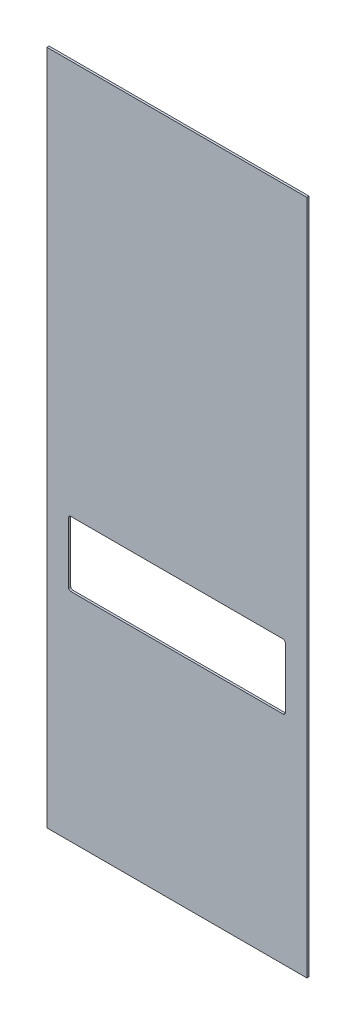
ISO-10303-21;
HEADER;
FILE_DESCRIPTION(('STEP AP214'),'2;1');
FILE_NAME('part.step','',(''),(''),'','','');
FILE_SCHEMA(('AUTOMOTIVE_DESIGN { 1 0 10303 214 1 1 1 1 }'));
ENDSEC;
DATA;
#1=APPLICATION_CONTEXT('core data for automotive mechanical design processes');
#2=APPLICATION_PROTOCOL_DEFINITION('international standard','automotive_design',2000,#1);
#3=PRODUCT_CONTEXT('',#1,'mechanical');
#4=PRODUCT('Part','Part','',(#3));
#5=PRODUCT_RELATED_PRODUCT_CATEGORY('part','',(#4));
#6=PRODUCT_DEFINITION_FORMATION('','',#4);
#7=PRODUCT_DEFINITION_CONTEXT('part definition',#1,'design');
#8=PRODUCT_DEFINITION('design','',#6,#7);
#9=PRODUCT_DEFINITION_SHAPE('','',#8);
#10=(LENGTH_UNIT() NAMED_UNIT(*) SI_UNIT(.MILLI.,.METRE.));
#11=(NAMED_UNIT(*) PLANE_ANGLE_UNIT() SI_UNIT($,.RADIAN.));
#12=(NAMED_UNIT(*) SI_UNIT($,.STERADIAN.) SOLID_ANGLE_UNIT());
#13=UNCERTAINTY_MEASURE_WITH_UNIT(LENGTH_MEASURE(1.E-05),#10,'distance_accuracy_value','');
#14=(GEOMETRIC_REPRESENTATION_CONTEXT(3) GLOBAL_UNCERTAINTY_ASSIGNED_CONTEXT((#13)) GLOBAL_UNIT_ASSIGNED_CONTEXT((#10,
#11,#12)) REPRESENTATION_CONTEXT('',''));
#15=CARTESIAN_POINT('',(0.,0.,0.));
#16=DIRECTION('',(0.,0.,1.));
#17=DIRECTION('',(1.,0.,0.));
#18=AXIS2_PLACEMENT_3D('',#15,#16,#17);
#19=CARTESIAN_POINT('',(0.,0.,6.35));
#20=DIRECTION('',(0.,0.,1.));
#21=DIRECTION('',(1.,0.,0.));
#22=AXIS2_PLACEMENT_3D('',#19,#20,#21);
#23=PLANE('',#22);
#24=CARTESIAN_POINT('',(311.15,-171.45,6.35));
#25=DIRECTION('',(0.,0.,-1.));
#26=DIRECTION('',(-1.,0.,0.));
#27=AXIS2_PLACEMENT_3D('',#24,#25,#26);
#28=CIRCLE('',#27,6.35);
#29=CARTESIAN_POINT('',(311.15,-165.1,6.35));
#30=VERTEX_POINT('',#29);
#31=CARTESIAN_POINT('',(317.5,-171.45,6.35));
#32=VERTEX_POINT('',#31);
#33=EDGE_CURVE('E19',#30,#32,#28,.T.);
#34=ORIENTED_EDGE('',*,*,#33,.T.);
#35=DIRECTION('',(0.,1.,0.));
#36=VECTOR('',#35,1.);
#37=CARTESIAN_POINT('',(317.5,-355.6,6.35));
#38=LINE('',#37,#36);
#39=CARTESIAN_POINT('',(317.5,-349.25,6.35));
#40=VERTEX_POINT('',#39);
#41=EDGE_CURVE('E143',#32,#40,#38,.F.);
#42=ORIENTED_EDGE('',*,*,#41,.T.);
#43=CARTESIAN_POINT('',(311.15,-349.25,6.35));
#44=DIRECTION('',(0.,0.,-1.));
#45=DIRECTION('',(-1.,0.,0.));
#46=AXIS2_PLACEMENT_3D('',#43,#44,#45);
#47=CIRCLE('',#46,6.35);
#48=CARTESIAN_POINT('',(311.15,-355.6,6.35));
#49=VERTEX_POINT('',#48);
#50=EDGE_CURVE('E163',#40,#49,#47,.T.);
#51=ORIENTED_EDGE('',*,*,#50,.T.);
#52=DIRECTION('',(1.,0.,0.));
#53=VECTOR('',#52,1.);
#54=CARTESIAN_POINT('',(-317.5,-355.6,6.35));
#55=LINE('',#54,#53);
#56=CARTESIAN_POINT('',(-311.15,-355.6,6.35));
#57=VERTEX_POINT('',#56);
#58=EDGE_CURVE('E139',#49,#57,#55,.F.);
#59=ORIENTED_EDGE('',*,*,#58,.T.);
#60=CARTESIAN_POINT('',(-311.15,-349.25,6.35));
#61=DIRECTION('',(0.,0.,-1.));
#62=DIRECTION('',(-1.,0.,0.));
#63=AXIS2_PLACEMENT_3D('',#60,#61,#62);
#64=CIRCLE('',#63,6.35);
#65=CARTESIAN_POINT('',(-317.5,-349.25,6.35));
#66=VERTEX_POINT('',#65);
#67=EDGE_CURVE('E162',#57,#66,#64,.T.);
#68=ORIENTED_EDGE('',*,*,#67,.T.);
#69=DIRECTION('',(0.,1.,0.));
#70=VECTOR('',#69,1.);
#71=CARTESIAN_POINT('',(-317.5,-165.1,6.35));
#72=LINE('',#71,#70);
#73=CARTESIAN_POINT('',(-317.5,-171.45,6.35));
#74=VERTEX_POINT('',#73);
#75=EDGE_CURVE('E136',#66,#74,#72,.T.);
#76=ORIENTED_EDGE('',*,*,#75,.T.);
#77=CARTESIAN_POINT('',(-311.15,-171.45,6.35));
#78=DIRECTION('',(0.,0.,-1.));
#79=DIRECTION('',(-1.,0.,0.));
#80=AXIS2_PLACEMENT_3D('',#77,#78,#79);
#81=CIRCLE('',#80,6.35);
#82=CARTESIAN_POINT('',(-311.15,-165.1,6.35));
#83=VERTEX_POINT('',#82);
#84=EDGE_CURVE('E159',#74,#83,#81,.T.);
#85=ORIENTED_EDGE('',*,*,#84,.T.);
#86=DIRECTION('',(1.,0.,0.));
#87=VECTOR('',#86,1.);
#88=CARTESIAN_POINT('',(317.5,-165.1,6.35));
#89=LINE('',#88,#87);
#90=EDGE_CURVE('E84',#83,#30,#89,.T.);
#91=ORIENTED_EDGE('',*,*,#90,.T.);
#92=EDGE_LOOP('',(#34,#42,#51,#59,#68,#76,#85,#91));
#93=FACE_BOUND('',#92,.T.);
#94=DIRECTION('',(0.,1.,0.));
#95=VECTOR('',#94,1.);
#96=CARTESIAN_POINT('',(381.,-990.6,6.35));
#97=LINE('',#96,#95);
#98=CARTESIAN_POINT('',(381.,990.6,6.35));
#99=VERTEX_POINT('',#98);
#100=CARTESIAN_POINT('',(381.,-990.6,6.35));
#101=VERTEX_POINT('',#100);
#102=EDGE_CURVE('E93',#99,#101,#97,.F.);
#103=ORIENTED_EDGE('',*,*,#102,.F.);
#104=DIRECTION('',(1.,0.,0.));
#105=VECTOR('',#104,1.);
#106=CARTESIAN_POINT('',(381.,990.6,6.35));
#107=LINE('',#106,#105);
#108=CARTESIAN_POINT('',(-381.,990.6,6.35));
#109=VERTEX_POINT('',#108);
#110=EDGE_CURVE('E120',#109,#99,#107,.T.);
#111=ORIENTED_EDGE('',*,*,#110,.F.);
#112=DIRECTION('',(0.,1.,0.));
#113=VECTOR('',#112,1.);
#114=CARTESIAN_POINT('',(-381.,990.6,6.35));
#115=LINE('',#114,#113);
#116=CARTESIAN_POINT('',(-381.,-990.6,6.35));
#117=VERTEX_POINT('',#116);
#118=EDGE_CURVE('E111',#117,#109,#115,.T.);
#119=ORIENTED_EDGE('',*,*,#118,.F.);
#120=DIRECTION('',(1.,0.,0.));
#121=VECTOR('',#120,1.);
#122=CARTESIAN_POINT('',(-381.,-990.6,6.35));
#123=LINE('',#122,#121);
#124=EDGE_CURVE('E105',#101,#117,#123,.F.);
#125=ORIENTED_EDGE('',*,*,#124,.F.);
#126=EDGE_LOOP('',(#103,#111,#119,#125));
#127=FACE_BOUND('',#126,.T.);
#128=ADVANCED_FACE('F16',(#93,#127),#23,.T.);
#129=CARTESIAN_POINT('',(381.,990.6,0.));
#130=DIRECTION('',(0.,1.,0.));
#131=DIRECTION('',(0.,0.,1.));
#132=AXIS2_PLACEMENT_3D('',#129,#130,#131);
#133=PLANE('',#132);
#134=DIRECTION('',(0.,0.,-1.));
#135=VECTOR('',#134,1.);
#136=CARTESIAN_POINT('',(381.,990.6,0.));
#137=LINE('',#136,#135);
#138=CARTESIAN_POINT('',(381.,990.6,0.));
#139=VERTEX_POINT('',#138);
#140=EDGE_CURVE('E181',#139,#99,#137,.F.);
#141=ORIENTED_EDGE('',*,*,#140,.F.);
#142=DIRECTION('',(1.,0.,0.));
#143=VECTOR('',#142,1.);
#144=CARTESIAN_POINT('',(0.,990.6,0.));
#145=LINE('',#144,#143);
#146=CARTESIAN_POINT('',(-381.,990.6,0.));
#147=VERTEX_POINT('',#146);
#148=EDGE_CURVE('E128',#139,#147,#145,.F.);
#149=ORIENTED_EDGE('',*,*,#148,.T.);
#150=DIRECTION('',(0.,0.,1.));
#151=VECTOR('',#150,1.);
#152=CARTESIAN_POINT('',(-381.,990.6,0.));
#153=LINE('',#152,#151);
#154=EDGE_CURVE('E116',#109,#147,#153,.F.);
#155=ORIENTED_EDGE('',*,*,#154,.F.);
#156=ORIENTED_EDGE('',*,*,#110,.T.);
#157=EDGE_LOOP('',(#141,#149,#155,#156));
#158=FACE_BOUND('',#157,.T.);
#159=ADVANCED_FACE('F126',(#158),#133,.T.);
#160=CARTESIAN_POINT('',(-381.,990.6,0.));
#161=DIRECTION('',(-1.,0.,0.));
#162=DIRECTION('',(0.,0.,1.));
#163=AXIS2_PLACEMENT_3D('',#160,#161,#162);
#164=PLANE('',#163);
#165=ORIENTED_EDGE('',*,*,#154,.T.);
#166=DIRECTION('',(0.,1.,0.));
#167=VECTOR('',#166,1.);
#168=CARTESIAN_POINT('',(-381.,0.,0.));
#169=LINE('',#168,#167);
#170=CARTESIAN_POINT('',(-381.,-990.6,0.));
#171=VERTEX_POINT('',#170);
#172=EDGE_CURVE('E191',#147,#171,#169,.F.);
#173=ORIENTED_EDGE('',*,*,#172,.T.);
#174=DIRECTION('',(0.,0.,-1.));
#175=VECTOR('',#174,1.);
#176=CARTESIAN_POINT('',(-381.,-990.6,0.));
#177=LINE('',#176,#175);
#178=EDGE_CURVE('E118',#117,#171,#177,.T.);
#179=ORIENTED_EDGE('',*,*,#178,.F.);
#180=ORIENTED_EDGE('',*,*,#118,.T.);
#181=EDGE_LOOP('',(#165,#173,#179,#180));
#182=FACE_BOUND('',#181,.T.);
#183=ADVANCED_FACE('F113',(#182),#164,.T.);
#184=CARTESIAN_POINT('',(-381.,-990.6,0.));
#185=DIRECTION('',(0.,-1.,0.));
#186=DIRECTION('',(0.,0.,-1.));
#187=AXIS2_PLACEMENT_3D('',#184,#185,#186);
#188=PLANE('',#187);
#189=ORIENTED_EDGE('',*,*,#178,.T.);
#190=DIRECTION('',(1.,0.,0.));
#191=VECTOR('',#190,1.);
#192=CARTESIAN_POINT('',(0.,-990.6,0.));
#193=LINE('',#192,#191);
#194=CARTESIAN_POINT('',(381.,-990.6,0.));
#195=VERTEX_POINT('',#194);
#196=EDGE_CURVE('E186',#171,#195,#193,.T.);
#197=ORIENTED_EDGE('',*,*,#196,.T.);
#198=DIRECTION('',(0.,0.,-1.));
#199=VECTOR('',#198,1.);
#200=CARTESIAN_POINT('',(381.,-990.6,0.));
#201=LINE('',#200,#199);
#202=EDGE_CURVE('E135',#101,#195,#201,.T.);
#203=ORIENTED_EDGE('',*,*,#202,.F.);
#204=ORIENTED_EDGE('',*,*,#124,.T.);
#205=EDGE_LOOP('',(#189,#197,#203,#204));
#206=FACE_BOUND('',#205,.T.);
#207=ADVANCED_FACE('F185',(#206),#188,.T.);
#208=CARTESIAN_POINT('',(381.,-990.6,0.));
#209=DIRECTION('',(1.,0.,0.));
#210=DIRECTION('',(0.,0.,-1.));
#211=AXIS2_PLACEMENT_3D('',#208,#209,#210);
#212=PLANE('',#211);
#213=ORIENTED_EDGE('',*,*,#202,.T.);
#214=DIRECTION('',(0.,1.,0.));
#215=VECTOR('',#214,1.);
#216=CARTESIAN_POINT('',(381.,0.,0.));
#217=LINE('',#216,#215);
#218=EDGE_CURVE('E193',#195,#139,#217,.T.);
#219=ORIENTED_EDGE('',*,*,#218,.T.);
#220=ORIENTED_EDGE('',*,*,#140,.T.);
#221=ORIENTED_EDGE('',*,*,#102,.T.);
#222=EDGE_LOOP('',(#213,#219,#220,#221));
#223=FACE_BOUND('',#222,.T.);
#224=ADVANCED_FACE('F222',(#223),#212,.T.);
#225=CARTESIAN_POINT('',(317.5,-165.1,6.35));
#226=DIRECTION('',(0.,1.,0.));
#227=DIRECTION('',(0.,0.,1.));
#228=AXIS2_PLACEMENT_3D('',#225,#226,#227);
#229=PLANE('',#228);
#230=DIRECTION('',(0.,0.,-1.));
#231=VECTOR('',#230,1.);
#232=CARTESIAN_POINT('',(-311.15,-165.1,14.62786));
#233=LINE('',#232,#231);
#234=CARTESIAN_POINT('',(-311.15,-165.1,0.));
#235=VERTEX_POINT('',#234);
#236=EDGE_CURVE('E161',#83,#235,#233,.T.);
#237=ORIENTED_EDGE('',*,*,#236,.T.);
#238=DIRECTION('',(1.,0.,0.));
#239=VECTOR('',#238,1.);
#240=CARTESIAN_POINT('',(0.,-165.1,0.));
#241=LINE('',#240,#239);
#242=CARTESIAN_POINT('',(311.15,-165.1,0.));
#243=VERTEX_POINT('',#242);
#244=EDGE_CURVE('E158',#235,#243,#241,.T.);
#245=ORIENTED_EDGE('',*,*,#244,.T.);
#246=DIRECTION('',(0.,0.,-1.));
#247=VECTOR('',#246,1.);
#248=CARTESIAN_POINT('',(311.15,-165.1,14.62786));
#249=LINE('',#248,#247);
#250=EDGE_CURVE('E134',#243,#30,#249,.F.);
#251=ORIENTED_EDGE('',*,*,#250,.T.);
#252=ORIENTED_EDGE('',*,*,#90,.F.);
#253=EDGE_LOOP('',(#237,#245,#251,#252));
#254=FACE_BOUND('',#253,.T.);
#255=ADVANCED_FACE('F225',(#254),#229,.F.);
#256=CARTESIAN_POINT('',(311.15,-171.45,14.62786));
#257=DIRECTION('',(0.,0.,-1.));
#258=DIRECTION('',(-1.,0.,0.));
#259=AXIS2_PLACEMENT_3D('',#256,#257,#258);
#260=CYLINDRICAL_SURFACE('',#259,6.35);
#261=DIRECTION('',(0.,0.,-1.));
#262=VECTOR('',#261,1.);
#263=CARTESIAN_POINT('',(317.5,-171.45,6.35));
#264=LINE('',#263,#262);
#265=CARTESIAN_POINT('',(317.5,-171.45,0.));
#266=VERTEX_POINT('',#265);
#267=EDGE_CURVE('E145',#266,#32,#264,.F.);
#268=ORIENTED_EDGE('',*,*,#267,.T.);
#269=ORIENTED_EDGE('',*,*,#33,.F.);
#270=ORIENTED_EDGE('',*,*,#250,.F.);
#271=CARTESIAN_POINT('',(311.15,-171.45,0.));
#272=DIRECTION('',(0.,0.,-1.));
#273=DIRECTION('',(-1.,0.,0.));
#274=AXIS2_PLACEMENT_3D('',#271,#272,#273);
#275=CIRCLE('',#274,6.35);
#276=EDGE_CURVE('E155',#243,#266,#275,.T.);
#277=ORIENTED_EDGE('',*,*,#276,.T.);
#278=EDGE_LOOP('',(#268,#269,#270,#277));
#279=FACE_BOUND('',#278,.T.);
#280=ADVANCED_FACE('F232',(#279),#260,.F.);
#281=CARTESIAN_POINT('',(317.5,-355.6,6.35));
#282=DIRECTION('',(1.,0.,0.));
#283=DIRECTION('',(0.,0.,-1.));
#284=AXIS2_PLACEMENT_3D('',#281,#282,#283);
#285=PLANE('',#284);
#286=ORIENTED_EDGE('',*,*,#267,.F.);
#287=DIRECTION('',(0.,1.,0.));
#288=VECTOR('',#287,1.);
#289=CARTESIAN_POINT('',(317.5,0.,0.));
#290=LINE('',#289,#288);
#291=CARTESIAN_POINT('',(317.5,-349.25,0.));
#292=VERTEX_POINT('',#291);
#293=EDGE_CURVE('E154',#266,#292,#290,.F.);
#294=ORIENTED_EDGE('',*,*,#293,.T.);
#295=DIRECTION('',(0.,0.,-1.));
#296=VECTOR('',#295,1.);
#297=CARTESIAN_POINT('',(317.5,-349.25,14.62786));
#298=LINE('',#297,#296);
#299=EDGE_CURVE('E144',#292,#40,#298,.F.);
#300=ORIENTED_EDGE('',*,*,#299,.T.);
#301=ORIENTED_EDGE('',*,*,#41,.F.);
#302=EDGE_LOOP('',(#286,#294,#300,#301));
#303=FACE_BOUND('',#302,.T.);
#304=ADVANCED_FACE('F254',(#303),#285,.F.);
#305=CARTESIAN_POINT('',(311.15,-349.25,14.62786));
#306=DIRECTION('',(0.,0.,-1.));
#307=DIRECTION('',(-1.,0.,0.));
#308=AXIS2_PLACEMENT_3D('',#305,#306,#307);
#309=CYLINDRICAL_SURFACE('',#308,6.35);
#310=DIRECTION('',(0.,0.,-1.));
#311=VECTOR('',#310,1.);
#312=CARTESIAN_POINT('',(311.15,-355.6,6.35));
#313=LINE('',#312,#311);
#314=CARTESIAN_POINT('',(311.15,-355.6,0.));
#315=VERTEX_POINT('',#314);
#316=EDGE_CURVE('E142',#315,#49,#313,.F.);
#317=ORIENTED_EDGE('',*,*,#316,.T.);
#318=ORIENTED_EDGE('',*,*,#50,.F.);
#319=ORIENTED_EDGE('',*,*,#299,.F.);
#320=CARTESIAN_POINT('',(311.15,-349.25,0.));
#321=DIRECTION('',(0.,0.,-1.));
#322=DIRECTION('',(-1.,0.,0.));
#323=AXIS2_PLACEMENT_3D('',#320,#321,#322);
#324=CIRCLE('',#323,6.35);
#325=EDGE_CURVE('E151',#292,#315,#324,.T.);
#326=ORIENTED_EDGE('',*,*,#325,.T.);
#327=EDGE_LOOP('',(#317,#318,#319,#326));
#328=FACE_BOUND('',#327,.T.);
#329=ADVANCED_FACE('F251',(#328),#309,.F.);
#330=CARTESIAN_POINT('',(-317.5,-355.6,6.35));
#331=DIRECTION('',(0.,-1.,0.));
#332=DIRECTION('',(0.,0.,-1.));
#333=AXIS2_PLACEMENT_3D('',#330,#331,#332);
#334=PLANE('',#333);
#335=DIRECTION('',(0.,0.,-1.));
#336=VECTOR('',#335,1.);
#337=CARTESIAN_POINT('',(-311.15,-355.6,14.62786));
#338=LINE('',#337,#336);
#339=CARTESIAN_POINT('',(-311.15,-355.6,0.));
#340=VERTEX_POINT('',#339);
#341=EDGE_CURVE('E141',#340,#57,#338,.F.);
#342=ORIENTED_EDGE('',*,*,#341,.T.);
#343=ORIENTED_EDGE('',*,*,#58,.F.);
#344=ORIENTED_EDGE('',*,*,#316,.F.);
#345=DIRECTION('',(1.,0.,0.));
#346=VECTOR('',#345,1.);
#347=CARTESIAN_POINT('',(0.,-355.6,0.));
#348=LINE('',#347,#346);
#349=EDGE_CURVE('E150',#315,#340,#348,.F.);
#350=ORIENTED_EDGE('',*,*,#349,.T.);
#351=EDGE_LOOP('',(#342,#343,#344,#350));
#352=FACE_BOUND('',#351,.T.);
#353=ADVANCED_FACE('F206',(#352),#334,.F.);
#354=CARTESIAN_POINT('',(-311.15,-349.25,14.62786));
#355=DIRECTION('',(0.,0.,-1.));
#356=DIRECTION('',(-1.,0.,0.));
#357=AXIS2_PLACEMENT_3D('',#354,#355,#356);
#358=CYLINDRICAL_SURFACE('',#357,6.35);
#359=DIRECTION('',(0.,0.,1.));
#360=VECTOR('',#359,1.);
#361=CARTESIAN_POINT('',(-317.5,-349.25,6.35));
#362=LINE('',#361,#360);
#363=CARTESIAN_POINT('',(-317.5,-349.25,0.));
#364=VERTEX_POINT('',#363);
#365=EDGE_CURVE('E138',#364,#66,#362,.T.);
#366=ORIENTED_EDGE('',*,*,#365,.T.);
#367=ORIENTED_EDGE('',*,*,#67,.F.);
#368=ORIENTED_EDGE('',*,*,#341,.F.);
#369=CARTESIAN_POINT('',(-311.15,-349.25,0.));
#370=DIRECTION('',(0.,0.,-1.));
#371=DIRECTION('',(-1.,0.,0.));
#372=AXIS2_PLACEMENT_3D('',#369,#370,#371);
#373=CIRCLE('',#372,6.35);
#374=EDGE_CURVE('E147',#340,#364,#373,.T.);
#375=ORIENTED_EDGE('',*,*,#374,.T.);
#376=EDGE_LOOP('',(#366,#367,#368,#375));
#377=FACE_BOUND('',#376,.T.);
#378=ADVANCED_FACE('F211',(#377),#358,.F.);
#379=CARTESIAN_POINT('',(-317.5,-165.1,6.35));
#380=DIRECTION('',(-1.,0.,0.));
#381=DIRECTION('',(0.,0.,1.));
#382=AXIS2_PLACEMENT_3D('',#379,#380,#381);
#383=PLANE('',#382);
#384=ORIENTED_EDGE('',*,*,#365,.F.);
#385=DIRECTION('',(0.,1.,0.));
#386=VECTOR('',#385,1.);
#387=CARTESIAN_POINT('',(-317.5,0.,0.));
#388=LINE('',#387,#386);
#389=CARTESIAN_POINT('',(-317.5,-171.45,0.));
#390=VERTEX_POINT('',#389);
#391=EDGE_CURVE('E25',#364,#390,#388,.T.);
#392=ORIENTED_EDGE('',*,*,#391,.T.);
#393=DIRECTION('',(0.,0.,-1.));
#394=VECTOR('',#393,1.);
#395=CARTESIAN_POINT('',(-317.5,-171.45,14.62786));
#396=LINE('',#395,#394);
#397=EDGE_CURVE('E33',#390,#74,#396,.F.);
#398=ORIENTED_EDGE('',*,*,#397,.T.);
#399=ORIENTED_EDGE('',*,*,#75,.F.);
#400=EDGE_LOOP('',(#384,#392,#398,#399));
#401=FACE_BOUND('',#400,.T.);
#402=ADVANCED_FACE('F242',(#401),#383,.F.);
#403=CARTESIAN_POINT('',(-311.15,-171.45,14.62786));
#404=DIRECTION('',(0.,0.,-1.));
#405=DIRECTION('',(-1.,0.,0.));
#406=AXIS2_PLACEMENT_3D('',#403,#404,#405);
#407=CYLINDRICAL_SURFACE('',#406,6.35);
#408=ORIENTED_EDGE('',*,*,#236,.F.);
#409=ORIENTED_EDGE('',*,*,#84,.F.);
#410=ORIENTED_EDGE('',*,*,#397,.F.);
#411=CARTESIAN_POINT('',(-311.15,-171.45,0.));
#412=DIRECTION('',(0.,0.,-1.));
#413=DIRECTION('',(-1.,0.,0.));
#414=AXIS2_PLACEMENT_3D('',#411,#412,#413);
#415=CIRCLE('',#414,6.35);
#416=EDGE_CURVE('E11',#390,#235,#415,.T.);
#417=ORIENTED_EDGE('',*,*,#416,.T.);
#418=EDGE_LOOP('',(#408,#409,#410,#417));
#419=FACE_BOUND('',#418,.T.);
#420=ADVANCED_FACE('F237',(#419),#407,.F.);
#421=CARTESIAN_POINT('',(0.,0.,0.));
#422=DIRECTION('',(0.,0.,1.));
#423=DIRECTION('',(1.,0.,0.));
#424=AXIS2_PLACEMENT_3D('',#421,#422,#423);
#425=PLANE('',#424);
#426=ORIENTED_EDGE('',*,*,#391,.F.);
#427=ORIENTED_EDGE('',*,*,#374,.F.);
#428=ORIENTED_EDGE('',*,*,#349,.F.);
#429=ORIENTED_EDGE('',*,*,#325,.F.);
#430=ORIENTED_EDGE('',*,*,#293,.F.);
#431=ORIENTED_EDGE('',*,*,#276,.F.);
#432=ORIENTED_EDGE('',*,*,#244,.F.);
#433=ORIENTED_EDGE('',*,*,#416,.F.);
#434=EDGE_LOOP('',(#426,#427,#428,#429,#430,#431,#432,#433));
#435=FACE_BOUND('',#434,.T.);
#436=ORIENTED_EDGE('',*,*,#196,.F.);
#437=ORIENTED_EDGE('',*,*,#172,.F.);
#438=ORIENTED_EDGE('',*,*,#148,.F.);
#439=ORIENTED_EDGE('',*,*,#218,.F.);
#440=EDGE_LOOP('',(#436,#437,#438,#439));
#441=FACE_BOUND('',#440,.T.);
#442=ADVANCED_FACE('F190',(#435,#441),#425,.F.);
#443=CLOSED_SHELL('',(#128,#159,#183,#207,#224,#255,#280,#304,#329,#353,#378,#402,#420,#442));
#444=MANIFOLD_SOLID_BREP('B1',#443);
#445=ADVANCED_BREP_SHAPE_REPRESENTATION('',(#18,#444),#14);
#446=SHAPE_DEFINITION_REPRESENTATION(#9,#445);
ENDSEC;
END-ISO-10303-21;
